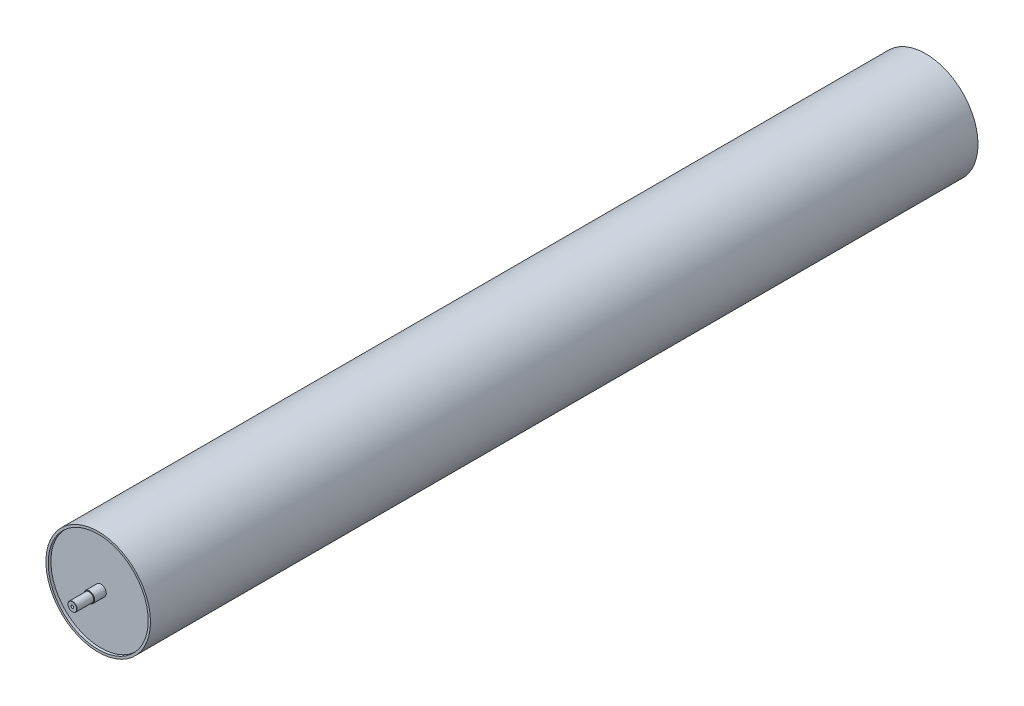
ISO-10303-21;
HEADER;
FILE_DESCRIPTION(('STEP AP214'),'2;1');
FILE_NAME('part.step','',(''),(''),'','','');
FILE_SCHEMA(('AUTOMOTIVE_DESIGN { 1 0 10303 214 1 1 1 1 }'));
ENDSEC;
DATA;
#1=APPLICATION_CONTEXT('core data for automotive mechanical design processes');
#2=APPLICATION_PROTOCOL_DEFINITION('international standard','automotive_design',2000,#1);
#3=PRODUCT_CONTEXT('',#1,'mechanical');
#4=PRODUCT('Part','Part','',(#3));
#5=PRODUCT_RELATED_PRODUCT_CATEGORY('part','',(#4));
#6=PRODUCT_DEFINITION_FORMATION('','',#4);
#7=PRODUCT_DEFINITION_CONTEXT('part definition',#1,'design');
#8=PRODUCT_DEFINITION('design','',#6,#7);
#9=PRODUCT_DEFINITION_SHAPE('','',#8);
#10=(LENGTH_UNIT() NAMED_UNIT(*) SI_UNIT(.MILLI.,.METRE.));
#11=(NAMED_UNIT(*) PLANE_ANGLE_UNIT() SI_UNIT($,.RADIAN.));
#12=(NAMED_UNIT(*) SI_UNIT($,.STERADIAN.) SOLID_ANGLE_UNIT());
#13=UNCERTAINTY_MEASURE_WITH_UNIT(LENGTH_MEASURE(1.E-05),#10,'distance_accuracy_value','');
#14=(GEOMETRIC_REPRESENTATION_CONTEXT(3) GLOBAL_UNCERTAINTY_ASSIGNED_CONTEXT((#13)) GLOBAL_UNIT_ASSIGNED_CONTEXT((#10,
#11,#12)) REPRESENTATION_CONTEXT('',''));
#15=CARTESIAN_POINT('',(0.,0.,0.));
#16=DIRECTION('',(0.,0.,1.));
#17=DIRECTION('',(1.,0.,0.));
#18=AXIS2_PLACEMENT_3D('',#15,#16,#17);
#19=CARTESIAN_POINT('',(0.,0.,767.5));
#20=DIRECTION('',(0.,0.,-1.));
#21=DIRECTION('',(-1.,0.,0.));
#22=AXIS2_PLACEMENT_3D('',#19,#20,#21);
#23=CYLINDRICAL_SURFACE('',#22,92.76);
#24=CARTESIAN_POINT('',(0.,0.,-762.5));
#25=DIRECTION('',(0.,0.,-1.));
#26=DIRECTION('',(-1.,0.,0.));
#27=AXIS2_PLACEMENT_3D('',#24,#25,#26);
#28=CIRCLE('',#27,92.76);
#29=CARTESIAN_POINT('',(-92.76,0.,-762.5));
#30=VERTEX_POINT('',#29);
#31=EDGE_CURVE('E11',#30,#30,#28,.T.);
#32=ORIENTED_EDGE('',*,*,#31,.F.);
#33=EDGE_LOOP('',(#32));
#34=FACE_BOUND('',#33,.T.);
#35=CARTESIAN_POINT('',(0.,0.,-767.5));
#36=DIRECTION('',(0.,0.,1.));
#37=DIRECTION('',(1.,0.,0.));
#38=AXIS2_PLACEMENT_3D('',#35,#36,#37);
#39=CIRCLE('',#38,92.76);
#40=CARTESIAN_POINT('',(92.76,0.,-767.5));
#41=VERTEX_POINT('',#40);
#42=EDGE_CURVE('E95',#41,#41,#39,.T.);
#43=ORIENTED_EDGE('',*,*,#42,.F.);
#44=EDGE_LOOP('',(#43));
#45=FACE_BOUND('',#44,.T.);
#46=ADVANCED_FACE('F39',(#34,#45),#23,.F.);
#47=CARTESIAN_POINT('',(0.,0.,767.5));
#48=DIRECTION('',(0.,0.,1.));
#49=DIRECTION('',(1.,0.,0.));
#50=AXIS2_PLACEMENT_3D('',#47,#48,#49);
#51=PLANE('',#50);
#52=CARTESIAN_POINT('',(0.,0.,767.5));
#53=DIRECTION('',(0.,0.,1.));
#54=DIRECTION('',(1.,0.,0.));
#55=AXIS2_PLACEMENT_3D('',#52,#53,#54);
#56=CIRCLE('',#55,97.);
#57=CARTESIAN_POINT('',(97.,0.,767.5));
#58=VERTEX_POINT('',#57);
#59=EDGE_CURVE('E102',#58,#58,#56,.T.);
#60=ORIENTED_EDGE('',*,*,#59,.T.);
#61=EDGE_LOOP('',(#60));
#62=FACE_BOUND('',#61,.T.);
#63=CARTESIAN_POINT('',(0.,0.,767.5));
#64=DIRECTION('',(0.,0.,1.));
#65=DIRECTION('',(1.,0.,0.));
#66=AXIS2_PLACEMENT_3D('',#63,#64,#65);
#67=CIRCLE('',#66,92.76);
#68=CARTESIAN_POINT('',(92.76,0.,767.5));
#69=VERTEX_POINT('',#68);
#70=EDGE_CURVE('E96',#69,#69,#67,.T.);
#71=ORIENTED_EDGE('',*,*,#70,.F.);
#72=EDGE_LOOP('',(#71));
#73=FACE_BOUND('',#72,.T.);
#74=ADVANCED_FACE('F150',(#62,#73),#51,.T.);
#75=CARTESIAN_POINT('',(0.,0.,-767.5));
#76=DIRECTION('',(0.,0.,1.));
#77=DIRECTION('',(1.,0.,0.));
#78=AXIS2_PLACEMENT_3D('',#75,#76,#77);
#79=PLANE('',#78);
#80=CARTESIAN_POINT('',(0.,0.,-767.5));
#81=DIRECTION('',(0.,0.,1.));
#82=DIRECTION('',(1.,0.,0.));
#83=AXIS2_PLACEMENT_3D('',#80,#81,#82);
#84=CIRCLE('',#83,97.);
#85=CARTESIAN_POINT('',(97.,0.,-767.5));
#86=VERTEX_POINT('',#85);
#87=EDGE_CURVE('E99',#86,#86,#84,.T.);
#88=ORIENTED_EDGE('',*,*,#87,.F.);
#89=EDGE_LOOP('',(#88));
#90=FACE_BOUND('',#89,.T.);
#91=ORIENTED_EDGE('',*,*,#42,.T.);
#92=EDGE_LOOP('',(#91));
#93=FACE_BOUND('',#92,.T.);
#94=ADVANCED_FACE('F156',(#90,#93),#79,.F.);
#95=CARTESIAN_POINT('',(0.,0.,767.5));
#96=DIRECTION('',(0.,0.,-1.));
#97=DIRECTION('',(-1.,0.,0.));
#98=AXIS2_PLACEMENT_3D('',#95,#96,#97);
#99=CYLINDRICAL_SURFACE('',#98,97.);
#100=ORIENTED_EDGE('',*,*,#59,.F.);
#101=EDGE_LOOP('',(#100));
#102=FACE_BOUND('',#101,.T.);
#103=ORIENTED_EDGE('',*,*,#87,.T.);
#104=EDGE_LOOP('',(#103));
#105=FACE_BOUND('',#104,.T.);
#106=ADVANCED_FACE('F158',(#102,#105),#99,.T.);
#107=CARTESIAN_POINT('',(0.,0.,762.5));
#108=DIRECTION('',(0.,0.,1.));
#109=DIRECTION('',(1.,0.,0.));
#110=AXIS2_PLACEMENT_3D('',#107,#108,#109);
#111=CIRCLE('',#110,92.76);
#112=CARTESIAN_POINT('',(92.76,0.,762.5));
#113=VERTEX_POINT('',#112);
#114=EDGE_CURVE('E91',#113,#113,#111,.T.);
#115=ORIENTED_EDGE('',*,*,#114,.F.);
#116=EDGE_LOOP('',(#115));
#117=FACE_BOUND('',#116,.T.);
#118=ORIENTED_EDGE('',*,*,#70,.T.);
#119=EDGE_LOOP('',(#118));
#120=FACE_BOUND('',#119,.T.);
#121=ADVANCED_FACE('F152',(#117,#120),#23,.F.);
#122=CARTESIAN_POINT('',(0.,0.,762.5));
#123=DIRECTION('',(0.,0.,1.));
#124=DIRECTION('',(1.,0.,0.));
#125=AXIS2_PLACEMENT_3D('',#122,#123,#124);
#126=PLANE('',#125);
#127=CARTESIAN_POINT('',(0.,-3.82061620902569E-11,762.5));
#128=DIRECTION('',(0.,0.,1.));
#129=DIRECTION('',(1.,0.,0.));
#130=AXIS2_PLACEMENT_3D('',#127,#128,#129);
#131=CIRCLE('',#130,10.0000000000198);
#132=CARTESIAN_POINT('',(10.0000000000198,-3.82061620902569E-11,762.5));
#133=VERTEX_POINT('',#132);
#134=EDGE_CURVE('E86',#133,#133,#131,.F.);
#135=ORIENTED_EDGE('',*,*,#134,.T.);
#136=EDGE_LOOP('',(#135));
#137=FACE_BOUND('',#136,.T.);
#138=ORIENTED_EDGE('',*,*,#114,.T.);
#139=EDGE_LOOP('',(#138));
#140=FACE_BOUND('',#139,.T.);
#141=ADVANCED_FACE('F215',(#137,#140),#126,.T.);
#142=CARTESIAN_POINT('',(0.,-2.04697370165261E-13,815.5));
#143=DIRECTION('',(0.,0.,-1.));
#144=DIRECTION('',(0.,1.,0.));
#145=AXIS2_PLACEMENT_3D('',#142,#143,#144);
#146=PLANE('',#145);
#147=CARTESIAN_POINT('',(0.,-2.12175048772293E-11,815.5));
#148=DIRECTION('',(0.,0.,1.));
#149=DIRECTION('',(1.,0.,0.));
#150=AXIS2_PLACEMENT_3D('',#147,#148,#149);
#151=CIRCLE('',#150,2.49999999999999);
#152=CARTESIAN_POINT('',(2.49999999999999,-2.12175048772293E-11,815.5));
#153=VERTEX_POINT('',#152);
#154=EDGE_CURVE('E74',#153,#153,#151,.T.);
#155=ORIENTED_EDGE('',*,*,#154,.F.);
#156=EDGE_LOOP('',(#155));
#157=FACE_BOUND('',#156,.T.);
#158=CARTESIAN_POINT('',(0.,-3.94825103983461E-11,815.5));
#159=DIRECTION('',(0.,0.,-1.));
#160=DIRECTION('',(0.,1.,0.));
#161=AXIS2_PLACEMENT_3D('',#158,#159,#160);
#162=CIRCLE('',#161,8.00000000003941);
#163=CARTESIAN_POINT('',(0.,7.99999999999992,815.5));
#164=VERTEX_POINT('',#163);
#165=EDGE_CURVE('E116',#164,#164,#162,.F.);
#166=ORIENTED_EDGE('',*,*,#165,.T.);
#167=EDGE_LOOP('',(#166));
#168=FACE_BOUND('',#167,.T.);
#169=ADVANCED_FACE('F209',(#157,#168),#146,.F.);
#170=CARTESIAN_POINT('',(0.,-2.04697370165263E-13,-815.5));
#171=DIRECTION('',(0.,0.,1.));
#172=DIRECTION('',(0.,-1.,0.));
#173=AXIS2_PLACEMENT_3D('',#170,#171,#172);
#174=CYLINDRICAL_SURFACE('',#173,8.50000000003911);
#175=CARTESIAN_POINT('',(0.,-3.94704693765717E-11,815.));
#176=DIRECTION('',(0.,0.,-1.));
#177=DIRECTION('',(0.,1.,0.));
#178=AXIS2_PLACEMENT_3D('',#175,#176,#177);
#179=CIRCLE('',#178,8.50000000003911);
#180=CARTESIAN_POINT('',(0.,8.49999999999964,815.));
#181=VERTEX_POINT('',#180);
#182=EDGE_CURVE('E119',#181,#181,#179,.T.);
#183=ORIENTED_EDGE('',*,*,#182,.T.);
#184=EDGE_LOOP('',(#183));
#185=FACE_BOUND('',#184,.T.);
#186=CARTESIAN_POINT('',(0.,-3.87359670483317E-11,784.5));
#187=DIRECTION('',(0.,0.,1.));
#188=DIRECTION('',(0.,-1.,0.));
#189=AXIS2_PLACEMENT_3D('',#186,#187,#188);
#190=CIRCLE('',#189,8.50000000003874);
#191=CARTESIAN_POINT('',(0.,-8.50000000007747,784.5));
#192=VERTEX_POINT('',#191);
#193=EDGE_CURVE('E80',#192,#192,#190,.T.);
#194=ORIENTED_EDGE('',*,*,#193,.T.);
#195=EDGE_LOOP('',(#194));
#196=FACE_BOUND('',#195,.T.);
#197=ADVANCED_FACE('F204',(#185,#196),#174,.T.);
#198=CARTESIAN_POINT('',(0.,8.5,784.5));
#199=DIRECTION('',(0.,0.,-1.));
#200=DIRECTION('',(0.,1.,0.));
#201=AXIS2_PLACEMENT_3D('',#198,#199,#200);
#202=PLANE('',#201);
#203=CARTESIAN_POINT('',(0.,-3.87359670483317E-11,784.5));
#204=DIRECTION('',(0.,0.,-1.));
#205=DIRECTION('',(0.,1.,0.));
#206=AXIS2_PLACEMENT_3D('',#203,#204,#205);
#207=CIRCLE('',#206,9.50000000003898);
#208=CARTESIAN_POINT('',(0.,9.50000000000025,784.5));
#209=VERTEX_POINT('',#208);
#210=EDGE_CURVE('E122',#209,#209,#207,.F.);
#211=ORIENTED_EDGE('',*,*,#210,.T.);
#212=EDGE_LOOP('',(#211));
#213=FACE_BOUND('',#212,.T.);
#214=ORIENTED_EDGE('',*,*,#193,.F.);
#215=EDGE_LOOP('',(#214));
#216=FACE_BOUND('',#215,.T.);
#217=ADVANCED_FACE('F201',(#213,#216),#202,.F.);
#218=CARTESIAN_POINT('',(0.,-2.04697370165263E-13,-815.5));
#219=DIRECTION('',(0.,0.,1.));
#220=DIRECTION('',(0.,-1.,0.));
#221=AXIS2_PLACEMENT_3D('',#218,#219,#220);
#222=CYLINDRICAL_SURFACE('',#221,10.0000000000198);
#223=CARTESIAN_POINT('',(0.,-3.87239260265577E-11,784.000000000019));
#224=DIRECTION('',(0.,0.,-1.));
#225=DIRECTION('',(0.,1.,0.));
#226=AXIS2_PLACEMENT_3D('',#223,#224,#225);
#227=CIRCLE('',#226,10.0000000000198);
#228=CARTESIAN_POINT('',(0.,9.99999999998112,784.000000000019));
#229=VERTEX_POINT('',#228);
#230=EDGE_CURVE('E125',#229,#229,#227,.T.);
#231=ORIENTED_EDGE('',*,*,#230,.T.);
#232=EDGE_LOOP('',(#231));
#233=FACE_BOUND('',#232,.T.);
#234=ORIENTED_EDGE('',*,*,#134,.F.);
#235=EDGE_LOOP('',(#234));
#236=FACE_BOUND('',#235,.T.);
#237=ADVANCED_FACE('F186',(#233,#236),#222,.T.);
#238=CARTESIAN_POINT('',(0.,-3.94825103983461E-11,815.5));
#239=DIRECTION('',(0.,0.,-1.));
#240=DIRECTION('',(0.,1.,0.));
#241=AXIS2_PLACEMENT_3D('',#238,#239,#240);
#242=CONICAL_SURFACE('',#241,8.00000000003952,0.78539816339754);
#243=ORIENTED_EDGE('',*,*,#182,.F.);
#244=EDGE_LOOP('',(#243));
#245=FACE_BOUND('',#244,.T.);
#246=ORIENTED_EDGE('',*,*,#165,.F.);
#247=EDGE_LOOP('',(#246));
#248=FACE_BOUND('',#247,.T.);
#249=ADVANCED_FACE('F180',(#245,#248),#242,.T.);
#250=CARTESIAN_POINT('',(0.,-3.87359670483317E-11,784.5));
#251=DIRECTION('',(0.,0.,-1.));
#252=DIRECTION('',(0.,1.,0.));
#253=AXIS2_PLACEMENT_3D('',#250,#251,#252);
#254=CONICAL_SURFACE('',#253,9.50000000003889,0.78539816339733);
#255=ORIENTED_EDGE('',*,*,#230,.F.);
#256=EDGE_LOOP('',(#255));
#257=FACE_BOUND('',#256,.T.);
#258=ORIENTED_EDGE('',*,*,#210,.F.);
#259=EDGE_LOOP('',(#258));
#260=FACE_BOUND('',#259,.T.);
#261=ADVANCED_FACE('F185',(#257,#260),#254,.T.);
#262=CARTESIAN_POINT('',(0.,-2.12175048772293E-11,800.5));
#263=DIRECTION('',(0.,0.,1.));
#264=DIRECTION('',(1.,0.,0.));
#265=AXIS2_PLACEMENT_3D('',#262,#263,#264);
#266=CONICAL_SURFACE('',#265,2.49999999999999,1.02974425867664);
#267=CARTESIAN_POINT('',(0.,-2.12175048772293E-11,798.997848452431));
#268=VERTEX_POINT('',#267);
#269=VERTEX_LOOP('',#268);
#270=FACE_BOUND('',#269,.T.);
#271=CARTESIAN_POINT('',(0.,-2.12175048772293E-11,800.5));
#272=DIRECTION('',(0.,0.,1.));
#273=DIRECTION('',(1.,0.,0.));
#274=AXIS2_PLACEMENT_3D('',#271,#272,#273);
#275=CIRCLE('',#274,2.49999999999999);
#276=CARTESIAN_POINT('',(2.49999999999999,-2.12175048772293E-11,800.5));
#277=VERTEX_POINT('',#276);
#278=EDGE_CURVE('E77',#277,#277,#275,.T.);
#279=ORIENTED_EDGE('',*,*,#278,.T.);
#280=EDGE_LOOP('',(#279));
#281=FACE_BOUND('',#280,.T.);
#282=ADVANCED_FACE('F191',(#270,#281),#266,.F.);
#283=CARTESIAN_POINT('',(0.,-2.12175048772293E-11,815.5));
#284=DIRECTION('',(0.,0.,1.));
#285=DIRECTION('',(1.,0.,0.));
#286=AXIS2_PLACEMENT_3D('',#283,#284,#285);
#287=CYLINDRICAL_SURFACE('',#286,2.49999999999999);
#288=ORIENTED_EDGE('',*,*,#278,.F.);
#289=EDGE_LOOP('',(#288));
#290=FACE_BOUND('',#289,.T.);
#291=ORIENTED_EDGE('',*,*,#154,.T.);
#292=EDGE_LOOP('',(#291));
#293=FACE_BOUND('',#292,.T.);
#294=ADVANCED_FACE('F144',(#290,#293),#287,.F.);
#295=CARTESIAN_POINT('',(0.,0.,-762.5));
#296=DIRECTION('',(0.,0.,-1.));
#297=DIRECTION('',(1.,0.,0.));
#298=AXIS2_PLACEMENT_3D('',#295,#296,#297);
#299=PLANE('',#298);
#300=CARTESIAN_POINT('',(0.,-1.48104567825453E-12,-762.5));
#301=DIRECTION('',(0.,0.,-1.));
#302=DIRECTION('',(-1.,0.,0.));
#303=AXIS2_PLACEMENT_3D('',#300,#301,#302);
#304=CIRCLE('',#303,10.0000000000198);
#305=CARTESIAN_POINT('',(-10.0000000000198,-1.48104567825453E-12,-762.5));
#306=VERTEX_POINT('',#305);
#307=EDGE_CURVE('E69',#306,#306,#304,.T.);
#308=ORIENTED_EDGE('',*,*,#307,.F.);
#309=EDGE_LOOP('',(#308));
#310=FACE_BOUND('',#309,.T.);
#311=ORIENTED_EDGE('',*,*,#31,.T.);
#312=EDGE_LOOP('',(#311));
#313=FACE_BOUND('',#312,.T.);
#314=ADVANCED_FACE('F140',(#310,#313),#299,.T.);
#315=CARTESIAN_POINT('',(0.,8.5,-815.5));
#316=DIRECTION('',(0.,0.,1.));
#317=DIRECTION('',(0.,-1.,0.));
#318=AXIS2_PLACEMENT_3D('',#315,#316,#317);
#319=PLANE('',#318);
#320=CARTESIAN_POINT('',(0.,-2.12175048772293E-11,-815.5));
#321=DIRECTION('',(0.,0.,-1.));
#322=DIRECTION('',(-1.,0.,0.));
#323=AXIS2_PLACEMENT_3D('',#320,#321,#322);
#324=CIRCLE('',#323,2.49999999999999);
#325=CARTESIAN_POINT('',(-2.49999999999999,-2.12175048772293E-11,-815.5));
#326=VERTEX_POINT('',#325);
#327=EDGE_CURVE('E66',#326,#326,#324,.T.);
#328=ORIENTED_EDGE('',*,*,#327,.F.);
#329=EDGE_LOOP('',(#328));
#330=FACE_BOUND('',#329,.T.);
#331=CARTESIAN_POINT('',(0.,-2.0469737016526E-13,-815.5));
#332=DIRECTION('',(0.,0.,1.));
#333=DIRECTION('',(0.,-1.,0.));
#334=AXIS2_PLACEMENT_3D('',#331,#332,#333);
#335=CIRCLE('',#334,7.99999999999999);
#336=CARTESIAN_POINT('',(0.,-8.0000000000002,-815.5));
#337=VERTEX_POINT('',#336);
#338=EDGE_CURVE('E113',#337,#337,#335,.F.);
#339=ORIENTED_EDGE('',*,*,#338,.T.);
#340=EDGE_LOOP('',(#339));
#341=FACE_BOUND('',#340,.T.);
#342=ADVANCED_FACE('F143',(#330,#341),#319,.F.);
#343=CARTESIAN_POINT('',(0.,-2.167383919397E-13,-815.));
#344=DIRECTION('',(0.,0.,1.));
#345=DIRECTION('',(0.,-1.,0.));
#346=AXIS2_PLACEMENT_3D('',#343,#344,#345);
#347=CONICAL_SURFACE('',#346,8.50000000000058,0.785398163397549);
#348=ORIENTED_EDGE('',*,*,#338,.F.);
#349=EDGE_LOOP('',(#348));
#350=FACE_BOUND('',#349,.T.);
#351=CARTESIAN_POINT('',(0.,-2.16738391939699E-13,-815.));
#352=DIRECTION('',(0.,0.,1.));
#353=DIRECTION('',(0.,-1.,0.));
#354=AXIS2_PLACEMENT_3D('',#351,#352,#353);
#355=CIRCLE('',#354,8.50000000000058);
#356=CARTESIAN_POINT('',(0.,-8.5000000000008,-815.));
#357=VERTEX_POINT('',#356);
#358=EDGE_CURVE('E90',#357,#357,#355,.T.);
#359=ORIENTED_EDGE('',*,*,#358,.F.);
#360=EDGE_LOOP('',(#359));
#361=FACE_BOUND('',#360,.T.);
#362=ADVANCED_FACE('F172',(#350,#361),#347,.T.);
#363=CARTESIAN_POINT('',(0.,-2.04697370165263E-13,-815.5));
#364=DIRECTION('',(0.,0.,1.));
#365=DIRECTION('',(0.,-1.,0.));
#366=AXIS2_PLACEMENT_3D('',#363,#364,#365);
#367=CYLINDRICAL_SURFACE('',#366,8.50000000000058);
#368=ORIENTED_EDGE('',*,*,#358,.T.);
#369=EDGE_LOOP('',(#368));
#370=FACE_BOUND('',#369,.T.);
#371=CARTESIAN_POINT('',(0.,-9.51240720179733E-13,-784.5));
#372=DIRECTION('',(0.,0.,1.));
#373=DIRECTION('',(0.,-1.,0.));
#374=AXIS2_PLACEMENT_3D('',#371,#372,#373);
#375=CIRCLE('',#374,8.50000000000095);
#376=CARTESIAN_POINT('',(0.,-8.5000000000019,-784.5));
#377=VERTEX_POINT('',#376);
#378=EDGE_CURVE('E83',#377,#377,#375,.T.);
#379=ORIENTED_EDGE('',*,*,#378,.F.);
#380=EDGE_LOOP('',(#379));
#381=FACE_BOUND('',#380,.T.);
#382=ADVANCED_FACE('F178',(#370,#381),#367,.T.);
#383=CARTESIAN_POINT('',(0.,10.,-784.5));
#384=DIRECTION('',(0.,0.,1.));
#385=DIRECTION('',(0.,-1.,0.));
#386=AXIS2_PLACEMENT_3D('',#383,#384,#385);
#387=PLANE('',#386);
#388=CARTESIAN_POINT('',(0.,-9.51240720179733E-13,-784.5));
#389=DIRECTION('',(0.,0.,1.));
#390=DIRECTION('',(0.,-1.,0.));
#391=AXIS2_PLACEMENT_3D('',#388,#389,#390);
#392=CIRCLE('',#391,9.50000000000115);
#393=CARTESIAN_POINT('',(0.,-9.5000000000021,-784.5));
#394=VERTEX_POINT('',#393);
#395=EDGE_CURVE('E131',#394,#394,#392,.F.);
#396=ORIENTED_EDGE('',*,*,#395,.T.);
#397=EDGE_LOOP('',(#396));
#398=FACE_BOUND('',#397,.T.);
#399=ORIENTED_EDGE('',*,*,#378,.T.);
#400=EDGE_LOOP('',(#399));
#401=FACE_BOUND('',#400,.T.);
#402=ADVANCED_FACE('F225',(#398,#401),#387,.F.);
#403=CARTESIAN_POINT('',(0.,-9.63281741954604E-13,-783.999999999982));
#404=DIRECTION('',(0.,0.,1.));
#405=DIRECTION('',(0.,-1.,0.));
#406=AXIS2_PLACEMENT_3D('',#403,#404,#405);
#407=CONICAL_SURFACE('',#406,10.0000000000198,0.785398163397639);
#408=ORIENTED_EDGE('',*,*,#395,.F.);
#409=EDGE_LOOP('',(#408));
#410=FACE_BOUND('',#409,.T.);
#411=CARTESIAN_POINT('',(0.,-9.63281741954605E-13,-783.999999999982));
#412=DIRECTION('',(0.,0.,1.));
#413=DIRECTION('',(0.,-1.,0.));
#414=AXIS2_PLACEMENT_3D('',#411,#412,#413);
#415=CIRCLE('',#414,10.0000000000198);
#416=CARTESIAN_POINT('',(0.,-10.0000000000208,-783.999999999982));
#417=VERTEX_POINT('',#416);
#418=EDGE_CURVE('E128',#417,#417,#415,.T.);
#419=ORIENTED_EDGE('',*,*,#418,.F.);
#420=EDGE_LOOP('',(#419));
#421=FACE_BOUND('',#420,.T.);
#422=ADVANCED_FACE('F42',(#410,#421),#407,.T.);
#423=ORIENTED_EDGE('',*,*,#307,.T.);
#424=EDGE_LOOP('',(#423));
#425=FACE_BOUND('',#424,.T.);
#426=ORIENTED_EDGE('',*,*,#418,.T.);
#427=EDGE_LOOP('',(#426));
#428=FACE_BOUND('',#427,.T.);
#429=ADVANCED_FACE('F59',(#425,#428),#222,.T.);
#430=CARTESIAN_POINT('',(0.,-2.12175048772293E-11,-800.5));
#431=DIRECTION('',(0.,0.,-1.));
#432=DIRECTION('',(-1.,0.,0.));
#433=AXIS2_PLACEMENT_3D('',#430,#431,#432);
#434=CONICAL_SURFACE('',#433,2.49999999999999,1.02974425867664);
#435=CARTESIAN_POINT('',(0.,-2.12175048772293E-11,-798.997848452431));
#436=VERTEX_POINT('',#435);
#437=VERTEX_LOOP('',#436);
#438=FACE_BOUND('',#437,.T.);
#439=CARTESIAN_POINT('',(0.,-2.12175048772293E-11,-800.5));
#440=DIRECTION('',(0.,0.,-1.));
#441=DIRECTION('',(-1.,0.,0.));
#442=AXIS2_PLACEMENT_3D('',#439,#440,#441);
#443=CIRCLE('',#442,2.49999999999999);
#444=CARTESIAN_POINT('',(-2.49999999999999,-2.12175048772293E-11,-800.5));
#445=VERTEX_POINT('',#444);
#446=EDGE_CURVE('E63',#445,#445,#443,.T.);
#447=ORIENTED_EDGE('',*,*,#446,.T.);
#448=EDGE_LOOP('',(#447));
#449=FACE_BOUND('',#448,.T.);
#450=ADVANCED_FACE('F55',(#438,#449),#434,.F.);
#451=CARTESIAN_POINT('',(0.,-2.12175048772293E-11,-815.5));
#452=DIRECTION('',(0.,0.,-1.));
#453=DIRECTION('',(-1.,0.,0.));
#454=AXIS2_PLACEMENT_3D('',#451,#452,#453);
#455=CYLINDRICAL_SURFACE('',#454,2.49999999999999);
#456=ORIENTED_EDGE('',*,*,#446,.F.);
#457=EDGE_LOOP('',(#456));
#458=FACE_BOUND('',#457,.T.);
#459=ORIENTED_EDGE('',*,*,#327,.T.);
#460=EDGE_LOOP('',(#459));
#461=FACE_BOUND('',#460,.T.);
#462=ADVANCED_FACE('F58',(#458,#461),#455,.F.);
#463=CLOSED_SHELL('',(#46,#74,#94,#106,#121,#141,#169,#197,#217,#237,#249,#261,#282,#294,#314,
#342,#362,#382,#402,#422,#429,#450,#462));
#464=CARTESIAN_POINT('',(0.,0.,-757.5));
#465=DIRECTION('',(0.,0.,-1.));
#466=DIRECTION('',(1.,0.,0.));
#467=AXIS2_PLACEMENT_3D('',#464,#465,#466);
#468=PLANE('',#467);
#469=CARTESIAN_POINT('',(0.,-1.6014558959988E-12,-757.5));
#470=DIRECTION('',(0.,0.,-1.));
#471=DIRECTION('',(-1.,0.,0.));
#472=AXIS2_PLACEMENT_3D('',#469,#470,#471);
#473=CIRCLE('',#472,10.0000000000198);
#474=CARTESIAN_POINT('',(-10.0000000000198,-1.6014558959988E-12,-757.5));
#475=VERTEX_POINT('',#474);
#476=EDGE_CURVE('E49',#475,#475,#473,.T.);
#477=ORIENTED_EDGE('',*,*,#476,.T.);
#478=EDGE_LOOP('',(#477));
#479=FACE_BOUND('',#478,.T.);
#480=CARTESIAN_POINT('',(0.,0.,-757.5));
#481=DIRECTION('',(0.,0.,1.));
#482=DIRECTION('',(1.,0.,0.));
#483=AXIS2_PLACEMENT_3D('',#480,#481,#482);
#484=CIRCLE('',#483,92.76);
#485=CARTESIAN_POINT('',(92.76,0.,-757.5));
#486=VERTEX_POINT('',#485);
#487=EDGE_CURVE('E65',#486,#486,#484,.T.);
#488=ORIENTED_EDGE('',*,*,#487,.T.);
#489=EDGE_LOOP('',(#488));
#490=FACE_BOUND('',#489,.T.);
#491=ADVANCED_FACE('F248',(#479,#490),#468,.F.);
#492=CARTESIAN_POINT('',(0.,0.,757.5));
#493=DIRECTION('',(0.,0.,1.));
#494=DIRECTION('',(1.,0.,0.));
#495=AXIS2_PLACEMENT_3D('',#492,#493,#494);
#496=CIRCLE('',#495,92.76);
#497=CARTESIAN_POINT('',(92.76,0.,757.5));
#498=VERTEX_POINT('',#497);
#499=EDGE_CURVE('E92',#498,#498,#496,.T.);
#500=ORIENTED_EDGE('',*,*,#499,.T.);
#501=EDGE_LOOP('',(#500));
#502=FACE_BOUND('',#501,.T.);
#503=ORIENTED_EDGE('',*,*,#487,.F.);
#504=EDGE_LOOP('',(#503));
#505=FACE_BOUND('',#504,.T.);
#506=ADVANCED_FACE('F153',(#502,#505),#23,.F.);
#507=CARTESIAN_POINT('',(0.,0.,757.5));
#508=DIRECTION('',(0.,0.,1.));
#509=DIRECTION('',(1.,0.,0.));
#510=AXIS2_PLACEMENT_3D('',#507,#508,#509);
#511=PLANE('',#510);
#512=CARTESIAN_POINT('',(0.,-3.80857518725126E-11,757.5));
#513=DIRECTION('',(0.,0.,1.));
#514=DIRECTION('',(1.,0.,0.));
#515=AXIS2_PLACEMENT_3D('',#512,#513,#514);
#516=CIRCLE('',#515,10.0000000000198);
#517=CARTESIAN_POINT('',(10.0000000000198,-3.80857518725126E-11,757.5));
#518=VERTEX_POINT('',#517);
#519=EDGE_CURVE('E87',#518,#518,#516,.F.);
#520=ORIENTED_EDGE('',*,*,#519,.F.);
#521=EDGE_LOOP('',(#520));
#522=FACE_BOUND('',#521,.T.);
#523=ORIENTED_EDGE('',*,*,#499,.F.);
#524=EDGE_LOOP('',(#523));
#525=FACE_BOUND('',#524,.T.);
#526=ADVANCED_FACE('F237',(#522,#525),#511,.F.);
#527=ORIENTED_EDGE('',*,*,#519,.T.);
#528=EDGE_LOOP('',(#527));
#529=FACE_BOUND('',#528,.T.);
#530=ORIENTED_EDGE('',*,*,#476,.F.);
#531=EDGE_LOOP('',(#530));
#532=FACE_BOUND('',#531,.T.);
#533=ADVANCED_FACE('F232',(#529,#532),#222,.T.);
#534=CLOSED_SHELL('',(#491,#506,#526,#533));
#535=ORIENTED_CLOSED_SHELL('',*,#534,.T.);
#536=BREP_WITH_VOIDS('B2',#463,(#535));
#537=ADVANCED_BREP_SHAPE_REPRESENTATION('',(#18,#536),#14);
#538=SHAPE_DEFINITION_REPRESENTATION(#9,#537);
ENDSEC;
END-ISO-10303-21;
